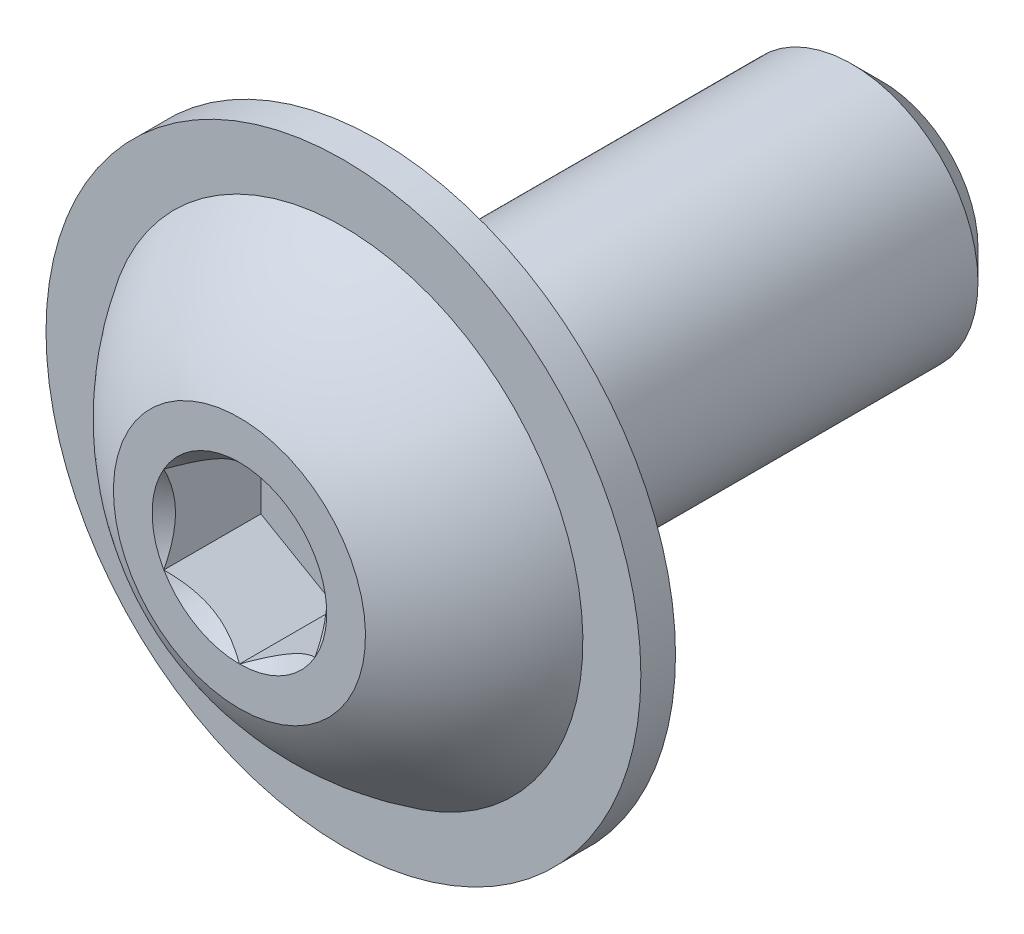
ISO-10303-21;
HEADER;
FILE_DESCRIPTION(('STEP AP214'),'2;1');
FILE_NAME('part.step','',(''),(''),'','','');
FILE_SCHEMA(('AUTOMOTIVE_DESIGN { 1 0 10303 214 1 1 1 1 }'));
ENDSEC;
DATA;
#1=APPLICATION_CONTEXT('core data for automotive mechanical design processes');
#2=APPLICATION_PROTOCOL_DEFINITION('international standard','automotive_design',2000,#1);
#3=PRODUCT_CONTEXT('',#1,'mechanical');
#4=PRODUCT('Part','Part','',(#3));
#5=PRODUCT_RELATED_PRODUCT_CATEGORY('part','',(#4));
#6=PRODUCT_DEFINITION_FORMATION('','',#4);
#7=PRODUCT_DEFINITION_CONTEXT('part definition',#1,'design');
#8=PRODUCT_DEFINITION('design','',#6,#7);
#9=PRODUCT_DEFINITION_SHAPE('','',#8);
#10=(LENGTH_UNIT() NAMED_UNIT(*) SI_UNIT(.MILLI.,.METRE.));
#11=(NAMED_UNIT(*) PLANE_ANGLE_UNIT() SI_UNIT($,.RADIAN.));
#12=(NAMED_UNIT(*) SI_UNIT($,.STERADIAN.) SOLID_ANGLE_UNIT());
#13=UNCERTAINTY_MEASURE_WITH_UNIT(LENGTH_MEASURE(1.E-05),#10,'distance_accuracy_value','');
#14=(GEOMETRIC_REPRESENTATION_CONTEXT(3) GLOBAL_UNCERTAINTY_ASSIGNED_CONTEXT((#13)) GLOBAL_UNIT_ASSIGNED_CONTEXT((#10,
#11,#12)) REPRESENTATION_CONTEXT('',''));
#15=CARTESIAN_POINT('',(0.,0.,0.));
#16=DIRECTION('',(0.,0.,1.));
#17=DIRECTION('',(1.,0.,0.));
#18=AXIS2_PLACEMENT_3D('',#15,#16,#17);
#19=CARTESIAN_POINT('',(0.,2.5,-6.375));
#20=DIRECTION('',(0.,0.,1.));
#21=DIRECTION('',(1.,0.,0.));
#22=AXIS2_PLACEMENT_3D('',#19,#20,#21);
#23=PLANE('',#22);
#24=CARTESIAN_POINT('',(0.,0.,-6.375));
#25=DIRECTION('',(0.,0.,1.));
#26=DIRECTION('',(1.,0.,0.));
#27=AXIS2_PLACEMENT_3D('',#24,#25,#26);
#28=CIRCLE('',#27,1.9);
#29=CARTESIAN_POINT('',(1.9,0.,-6.375));
#30=VERTEX_POINT('',#29);
#31=EDGE_CURVE('E55',#30,#30,#28,.F.);
#32=ORIENTED_EDGE('',*,*,#31,.T.);
#33=EDGE_LOOP('',(#32));
#34=FACE_BOUND('',#33,.T.);
#35=ADVANCED_FACE('F41',(#34),#23,.F.);
#36=CARTESIAN_POINT('',(0.,0.,6.375));
#37=DIRECTION('',(0.,0.,1.));
#38=DIRECTION('',(1.,0.,0.));
#39=AXIS2_PLACEMENT_3D('',#36,#37,#38);
#40=CYLINDRICAL_SURFACE('',#39,2.5);
#41=CARTESIAN_POINT('',(0.,0.,-5.775));
#42=DIRECTION('',(0.,0.,1.));
#43=DIRECTION('',(1.,0.,0.));
#44=AXIS2_PLACEMENT_3D('',#41,#42,#43);
#45=CIRCLE('',#44,2.5);
#46=CARTESIAN_POINT('',(2.5,0.,-5.775));
#47=VERTEX_POINT('',#46);
#48=EDGE_CURVE('E189',#47,#47,#45,.T.);
#49=ORIENTED_EDGE('',*,*,#48,.T.);
#50=EDGE_LOOP('',(#49));
#51=FACE_BOUND('',#50,.T.);
#52=CARTESIAN_POINT('',(0.,0.,3.625));
#53=DIRECTION('',(0.,0.,1.));
#54=DIRECTION('',(1.,0.,0.));
#55=AXIS2_PLACEMENT_3D('',#52,#53,#54);
#56=CIRCLE('',#55,2.5);
#57=CARTESIAN_POINT('',(2.5,0.,3.625));
#58=VERTEX_POINT('',#57);
#59=EDGE_CURVE('E186',#58,#58,#56,.T.);
#60=ORIENTED_EDGE('',*,*,#59,.F.);
#61=EDGE_LOOP('',(#60));
#62=FACE_BOUND('',#61,.T.);
#63=ADVANCED_FACE('F198',(#51,#62),#40,.T.);
#64=CARTESIAN_POINT('',(0.,0.,-5.775));
#65=DIRECTION('',(0.,0.,1.));
#66=DIRECTION('',(1.,0.,0.));
#67=AXIS2_PLACEMENT_3D('',#64,#65,#66);
#68=CONICAL_SURFACE('',#67,2.5,0.785398163397448);
#69=ORIENTED_EDGE('',*,*,#31,.F.);
#70=EDGE_LOOP('',(#69));
#71=FACE_BOUND('',#70,.T.);
#72=ORIENTED_EDGE('',*,*,#48,.F.);
#73=EDGE_LOOP('',(#72));
#74=FACE_BOUND('',#73,.T.);
#75=ADVANCED_FACE('F43',(#71,#74),#68,.T.);
#76=CARTESIAN_POINT('',(0.,-5.9,3.625));
#77=DIRECTION('',(0.,0.,1.));
#78=DIRECTION('',(0.,-1.,0.));
#79=AXIS2_PLACEMENT_3D('',#76,#77,#78);
#80=PLANE('',#79);
#81=CARTESIAN_POINT('',(0.,0.,3.625));
#82=DIRECTION('',(0.,0.,1.));
#83=DIRECTION('',(0.,-1.,0.));
#84=AXIS2_PLACEMENT_3D('',#81,#82,#83);
#85=CIRCLE('',#84,5.9);
#86=CARTESIAN_POINT('',(0.,-5.9,3.625));
#87=VERTEX_POINT('',#86);
#88=EDGE_CURVE('E180',#87,#87,#85,.T.);
#89=ORIENTED_EDGE('',*,*,#88,.F.);
#90=EDGE_LOOP('',(#89));
#91=FACE_BOUND('',#90,.T.);
#92=ORIENTED_EDGE('',*,*,#59,.T.);
#93=EDGE_LOOP('',(#92));
#94=FACE_BOUND('',#93,.T.);
#95=ADVANCED_FACE('F197',(#91,#94),#80,.F.);
#96=CARTESIAN_POINT('',(0.,0.,1.38920454545455));
#97=DIRECTION('',(0.,0.,1.));
#98=DIRECTION('',(0.,-1.,0.));
#99=AXIS2_PLACEMENT_3D('',#96,#97,#98);
#100=SPHERICAL_SURFACE('',#99,5.57746862963532);
#101=CARTESIAN_POINT('',(0.,0.,6.375));
#102=DIRECTION('',(0.,0.,1.));
#103=DIRECTION('',(0.,-1.,0.));
#104=AXIS2_PLACEMENT_3D('',#101,#102,#103);
#105=CIRCLE('',#104,2.5);
#106=CARTESIAN_POINT('',(0.,-2.5,6.375));
#107=VERTEX_POINT('',#106);
#108=EDGE_CURVE('E183',#107,#107,#105,.T.);
#109=CARTESIAN_POINT('',(0.,0.,4.3125));
#110=DIRECTION('',(0.,0.,1.));
#111=DIRECTION('',(0.,-1.,0.));
#112=AXIS2_PLACEMENT_3D('',#109,#110,#111);
#113=CIRCLE('',#112,4.75);
#114=CARTESIAN_POINT('',(0.,-4.75,4.3125));
#115=VERTEX_POINT('',#114);
#116=EDGE_CURVE('E174',#115,#115,#113,.T.);
#117=CARTESIAN_POINT('',(0.,-2.5,6.375));
#118=CARTESIAN_POINT('',(0.,-2.52878890131394,6.36056457313272));
#119=CARTESIAN_POINT('',(0.,-2.55745274597167,6.34587974551416));
#120=CARTESIAN_POINT('',(0.,-2.61452178222533,6.31601581212042));
#121=CARTESIAN_POINT('',(0.,-2.64292697382127,6.30083670634525));
#122=CARTESIAN_POINT('',(0.,-2.69947016420197,6.26998873998428));
#123=CARTESIAN_POINT('',(0.,-2.72760816298673,6.25431987939847));
#124=CARTESIAN_POINT('',(0.,-2.78360852896654,6.2224971134603));
#125=CARTESIAN_POINT('',(0.,-2.81147089616158,6.20634320810794));
#126=CARTESIAN_POINT('',(0.,-2.86691163731792,6.1735551975762));
#127=CARTESIAN_POINT('',(0.,-2.89449001127922,6.15692109239683));
#128=CARTESIAN_POINT('',(0.,-2.94935449103304,6.12317767409414));
#129=CARTESIAN_POINT('',(0.,-2.97664059682555,6.10606836097081));
#130=CARTESIAN_POINT('',(0.,-3.03091235260555,6.07137966049103));
#131=CARTESIAN_POINT('',(0.,-3.05789800259303,6.05380027313459));
#132=CARTESIAN_POINT('',(0.,-3.1115607493896,6.01817669915619));
#133=CARTESIAN_POINT('',(0.,-3.13823784619868,6.00013251253424));
#134=CARTESIAN_POINT('',(0.,-3.19127548182177,5.96358475440661));
#135=CARTESIAN_POINT('',(0.,-3.21763602063577,5.94508118290094));
#136=CARTESIAN_POINT('',(0.,-3.27003263044704,5.9076202072468));
#137=CARTESIAN_POINT('',(0.,-3.29606870144431,5.88866280309833));
#138=CARTESIAN_POINT('',(0.,-3.34780856315923,5.85029985057398));
#139=CARTESIAN_POINT('',(0.,-3.37351235387688,5.83089430219809));
#140=CARTESIAN_POINT('',(0.,-3.42457994227522,5.79164088410686));
#141=CARTESIAN_POINT('',(0.,-3.44994373995591,5.77179301439151));
#142=CARTESIAN_POINT('',(0.,-3.50032373154223,5.7316609092333));
#143=CARTESIAN_POINT('',(0.,-3.52533992544785,5.71137667379044));
#144=CARTESIAN_POINT('',(0.,-3.57501720304897,5.67037792372646));
#145=CARTESIAN_POINT('',(0.,-3.59967828674447,5.64966340910535));
#146=CARTESIAN_POINT('',(0.,-3.64863794404574,5.60781031634496));
#147=CARTESIAN_POINT('',(0.,-3.67293651765152,5.5866717382057));
#148=CARTESIAN_POINT('',(0.,-3.7211638636696,5.54397686131492));
#149=CARTESIAN_POINT('',(0.,-3.74509263608192,5.52242056256341));
#150=CARTESIAN_POINT('',(0.,-3.79257319957304,5.47889671269655));
#151=CARTESIAN_POINT('',(0.,-3.81612499065184,5.4569291615812));
#152=CARTESIAN_POINT('',(0.,-3.86284452445404,5.41258939863672));
#153=CARTESIAN_POINT('',(0.,-3.88601226717743,5.39021718680758));
#154=CARTESIAN_POINT('',(0.,-3.93195675248562,5.34507481550929));
#155=CARTESIAN_POINT('',(0.,-3.95473349507042,5.32230465604014));
#156=CARTESIAN_POINT('',(0.,-3.99988914564293,5.27637322194495));
#157=CARTESIAN_POINT('',(0.,-4.02226805363064,5.25321194731892));
#158=CARTESIAN_POINT('',(0.,-4.06662131992594,5.20650523275232));
#159=CARTESIAN_POINT('',(0.,-4.08859567823351,5.18295979281175));
#160=CARTESIAN_POINT('',(0.,-4.13213325147596,5.13549181273227));
#161=CARTESIAN_POINT('',(0.,-4.15369646641083,5.11156927259335));
#162=CARTESIAN_POINT('',(0.,-4.19640528258393,5.06335427038701));
#163=CARTESIAN_POINT('',(0.,-4.21755088382217,5.0390618083196));
#164=CARTESIAN_POINT('',(0.,-4.25941812758953,4.99011425152665));
#165=CARTESIAN_POINT('',(0.,-4.28013977011866,4.96545915680112));
#166=CARTESIAN_POINT('',(0.,-4.32115287866592,4.9157937327726));
#167=CARTESIAN_POINT('',(0.,-4.34144434468406,4.89078340346961));
#168=CARTESIAN_POINT('',(0.,-4.38159101150148,4.84041501496851));
#169=CARTESIAN_POINT('',(0.,-4.40144621230078,4.81505695577041));
#170=CARTESIAN_POINT('',(0.,-4.44071439082757,4.76400071646896));
#171=CARTESIAN_POINT('',(0.,-4.46012736855507,4.73830253636561));
#172=CARTESIAN_POINT('',(0.,-4.49850527597488,4.68657376642581));
#173=CARTESIAN_POINT('',(0.,-4.51747020566719,4.66054317658937));
#174=CARTESIAN_POINT('',(0.,-4.55494632576898,4.60815739763448));
#175=CARTESIAN_POINT('',(0.,-4.57345751617845,4.58180220851605));
#176=CARTESIAN_POINT('',(0.,-4.6100206053302,4.52877514058363));
#177=CARTESIAN_POINT('',(0.,-4.62807250407247,4.50210326176965));
#178=CARTESIAN_POINT('',(0.,-4.6637115851972,4.44845081258398));
#179=CARTESIAN_POINT('',(0.,-4.68129876757966,4.42147024221229));
#180=CARTESIAN_POINT('',(0.,-4.71600316852223,4.36720852484281));
#181=CARTESIAN_POINT('',(0.,-4.73312038708234,4.33992737784503));
#182=CARTESIAN_POINT('',(0.,-4.75,4.3125));
#183=B_SPLINE_CURVE_WITH_KNOTS('',3,(#117,#118,#119,#120,#121,#122,#123,#124,#125,#126,#127,
#128,#129,#130,#131,#132,#133,#134,#135,#136,#137,#138,#139,#140,#141,#142,#143,#144,#145,#146,
#147,#148,#149,#150,#151,#152,#153,#154,#155,#156,#157,#158,#159,#160,#161,#162,#163,#164,#165,
#166,#167,#168,#169,#170,#171,#172,#173,#174,#175,#176,#177,#178,#179,#180,#181,#182),
.UNSPECIFIED.,.F.,.F.,(4,2,2,2,2,2,2,2,2,2,2,2,2,2,2,2,2,2,2,2,2,2,2,2,2,2,2,2,2,2,2,2,4),(0.,
0.0966147389287726,0.193229477857545,0.289844216786317,0.386458955715089,0.483073694643862,
0.579688433572634,0.676303172501407,0.772917911430179,0.869532650358951,0.966147389287723,
1.06276212821649,1.15937686714527,1.25599160607404,1.35260634500281,1.44922108393158,
1.54583582286036,1.64245056178913,1.7390653007179,1.83568003964667,1.93229477857545,
2.02890951750422,2.12552425643299,2.22213899536176,2.31875373429053,2.41536847321931,
2.51198321214808,2.60859795107685,2.70521269000562,2.8018274289344,2.89844216786317,
2.99505690679194,3.09167164572071),.UNSPECIFIED.);
#184=EDGE_CURVE('BSEAM207',#107,#115,#183,.T.);
#185=ORIENTED_EDGE('',*,*,#108,.F.);
#186=ORIENTED_EDGE('',*,*,#116,.T.);
#187=ORIENTED_EDGE('',*,*,#184,.T.);
#188=ORIENTED_EDGE('',*,*,#184,.F.);
#189=EDGE_LOOP('',(#185,#187,#186,#188));
#190=FACE_BOUND('',#189,.T.);
#191=ADVANCED_FACE('F207',(#190),#100,.T.);
#192=CARTESIAN_POINT('',(0.,-2.5,6.375));
#193=DIRECTION('',(0.,0.,-1.));
#194=DIRECTION('',(0.,1.,0.));
#195=AXIS2_PLACEMENT_3D('',#192,#193,#194);
#196=PLANE('',#195);
#197=CARTESIAN_POINT('',(0.,0.,6.375));
#198=DIRECTION('',(0.,0.,1.));
#199=DIRECTION('',(1.,0.,0.));
#200=AXIS2_PLACEMENT_3D('',#197,#198,#199);
#201=CIRCLE('',#200,1.73205080756888);
#202=CARTESIAN_POINT('',(0.,1.73205080756888,6.375));
#203=VERTEX_POINT('',#202);
#204=CARTESIAN_POINT('',(-1.5,0.866025403784438,6.375));
#205=VERTEX_POINT('',#204);
#206=EDGE_CURVE('E141',#203,#205,#201,.T.);
#207=ORIENTED_EDGE('',*,*,#206,.F.);
#208=CARTESIAN_POINT('',(1.5,0.866025403784439,6.375));
#209=VERTEX_POINT('',#208);
#210=EDGE_CURVE('E138',#209,#203,#201,.T.);
#211=ORIENTED_EDGE('',*,*,#210,.F.);
#212=CARTESIAN_POINT('',(1.5,-0.866025403784439,6.375));
#213=VERTEX_POINT('',#212);
#214=EDGE_CURVE('E108',#213,#209,#201,.T.);
#215=ORIENTED_EDGE('',*,*,#214,.F.);
#216=CARTESIAN_POINT('',(0.,-1.73205080756888,6.375));
#217=VERTEX_POINT('',#216);
#218=EDGE_CURVE('E100',#217,#213,#201,.T.);
#219=ORIENTED_EDGE('',*,*,#218,.F.);
#220=CARTESIAN_POINT('',(-1.5,-0.866025403784439,6.375));
#221=VERTEX_POINT('',#220);
#222=EDGE_CURVE('E61',#221,#217,#201,.T.);
#223=ORIENTED_EDGE('',*,*,#222,.F.);
#224=EDGE_CURVE('E68',#205,#221,#201,.T.);
#225=ORIENTED_EDGE('',*,*,#224,.F.);
#226=EDGE_LOOP('',(#207,#211,#215,#219,#223,#225));
#227=FACE_BOUND('',#226,.T.);
#228=ORIENTED_EDGE('',*,*,#108,.T.);
#229=EDGE_LOOP('',(#228));
#230=FACE_BOUND('',#229,.T.);
#231=ADVANCED_FACE('F135',(#227,#230),#196,.F.);
#232=CARTESIAN_POINT('',(0.,0.,6.375));
#233=DIRECTION('',(0.,0.,1.));
#234=DIRECTION('',(0.,-1.,0.));
#235=AXIS2_PLACEMENT_3D('',#232,#233,#234);
#236=CYLINDRICAL_SURFACE('',#235,5.9);
#237=CARTESIAN_POINT('',(0.,0.,4.3125));
#238=DIRECTION('',(0.,0.,1.));
#239=DIRECTION('',(0.,-1.,0.));
#240=AXIS2_PLACEMENT_3D('',#237,#238,#239);
#241=CIRCLE('',#240,5.9);
#242=CARTESIAN_POINT('',(0.,-5.9,4.3125));
#243=VERTEX_POINT('',#242);
#244=EDGE_CURVE('E177',#243,#243,#241,.T.);
#245=ORIENTED_EDGE('',*,*,#244,.F.);
#246=EDGE_LOOP('',(#245));
#247=FACE_BOUND('',#246,.T.);
#248=ORIENTED_EDGE('',*,*,#88,.T.);
#249=EDGE_LOOP('',(#248));
#250=FACE_BOUND('',#249,.T.);
#251=ADVANCED_FACE('F222',(#247,#250),#236,.T.);
#252=CARTESIAN_POINT('',(0.,-4.75,4.3125));
#253=DIRECTION('',(0.,0.,-1.));
#254=DIRECTION('',(0.,1.,0.));
#255=AXIS2_PLACEMENT_3D('',#252,#253,#254);
#256=PLANE('',#255);
#257=ORIENTED_EDGE('',*,*,#116,.F.);
#258=EDGE_LOOP('',(#257));
#259=FACE_BOUND('',#258,.T.);
#260=ORIENTED_EDGE('',*,*,#244,.T.);
#261=EDGE_LOOP('',(#260));
#262=FACE_BOUND('',#261,.T.);
#263=ADVANCED_FACE('F228',(#259,#262),#256,.F.);
#264=CARTESIAN_POINT('',(0.,0.,6.375));
#265=DIRECTION('',(0.,0.,1.));
#266=DIRECTION('',(1.,0.,0.));
#267=AXIS2_PLACEMENT_3D('',#264,#265,#266);
#268=CONICAL_SURFACE('',#267,1.73205080756888,0.78539816339745);
#269=ORIENTED_EDGE('',*,*,#214,.T.);
#270=CARTESIAN_POINT('',(1.5,-1.72720812969693,6.93057851627079));
#271=CARTESIAN_POINT('',(1.5,-1.68515175699268,6.89882990785743));
#272=CARTESIAN_POINT('',(1.5,-1.64286104748674,6.86739259380738));
#273=CARTESIAN_POINT('',(1.5,-1.55771581035942,6.80526908755641));
#274=CARTESIAN_POINT('',(1.5,-1.51486114386668,6.7745830858922));
#275=CARTESIAN_POINT('',(1.5,-1.3846813415127,6.68340719242716));
#276=CARTESIAN_POINT('',(1.5,-1.29637976071654,6.62428834342677));
#277=CARTESIAN_POINT('',(1.5,-1.11121478730467,6.5082309963165));
#278=CARTESIAN_POINT('',(1.5,-1.01415038238167,6.45160955873301));
#279=CARTESIAN_POINT('',(1.5,-0.815173408897605,6.34803688126565));
#280=CARTESIAN_POINT('',(1.5,-0.713278669253285,6.30105304154167));
#281=CARTESIAN_POINT('',(1.5,-0.560333774943111,6.24357266843083));
#282=CARTESIAN_POINT('',(1.5,-0.511547982948042,6.22707538775725));
#283=CARTESIAN_POINT('',(1.5,-0.412798620136866,6.197997512927));
#284=CARTESIAN_POINT('',(1.5,-0.362834968437563,6.18541718859402));
#285=CARTESIAN_POINT('',(1.5,-0.262863235444982,6.16503619414677));
#286=CARTESIAN_POINT('',(1.5,-0.212872113808023,6.15715363274598));
#287=CARTESIAN_POINT('',(1.5,-0.112355243569546,6.146322063969));
#288=CARTESIAN_POINT('',(1.5,-0.0618295883726283,6.14337220852435));
#289=CARTESIAN_POINT('',(1.5,0.0374291733323837,6.14262485772485));
#290=CARTESIAN_POINT('',(1.5,0.0861609672002985,6.14464473355808));
#291=CARTESIAN_POINT('',(1.5,0.183206937768826,6.15332255289676));
#292=CARTESIAN_POINT('',(1.5,0.231521073438268,6.15998094696846));
#293=CARTESIAN_POINT('',(1.5,0.328199853425435,6.17768524412257));
#294=CARTESIAN_POINT('',(1.5,0.376550616310328,6.18880581125704));
#295=CARTESIAN_POINT('',(1.5,0.472195697125598,6.21484341404871));
#296=CARTESIAN_POINT('',(1.5,0.51949010309274,6.22976013204094));
#297=CARTESIAN_POINT('',(1.5,0.668391282696624,6.28233522359607));
#298=CARTESIAN_POINT('',(1.5,0.767878709508552,6.32598128747198));
#299=CARTESIAN_POINT('',(1.5,0.962179866690724,6.4230229945931));
#300=CARTESIAN_POINT('',(1.5,1.05697519961444,6.47645366508953));
#301=CARTESIAN_POINT('',(1.5,1.23814273533383,6.58668585200456));
#302=CARTESIAN_POINT('',(1.5,1.3246994218129,6.64318792069859));
#303=CARTESIAN_POINT('',(1.5,1.45222331290673,6.73053430157866));
#304=CARTESIAN_POINT('',(1.5,1.49418091978756,6.75995775868004));
#305=CARTESIAN_POINT('',(1.5,1.57752272931476,6.81958282183046));
#306=CARTESIAN_POINT('',(1.5,1.61890708647354,6.84978421166444));
#307=CARTESIAN_POINT('',(1.5,1.66005278019494,6.88030817860946));
#308=B_SPLINE_CURVE_WITH_KNOTS('',3,(#270,#271,#272,#273,#274,#275,#276,#277,#278,#279,#280,
#281,#282,#283,#284,#285,#286,#287,#288,#289,#290,#291,#292,#293,#294,#295,#296,#297,#298,#299,
#300,#301,#302,#303,#304,#305,#306,#307),.UNSPECIFIED.,.F.,.F.,(4,2,2,2,2,2,2,2,2,2,2,2,2,2,2,2,
2,2,4),(0.,0.158079548982668,0.316198780993942,0.63485041734696,0.971690311361511,
1.30737131660667,1.46173961127089,1.61611853740677,1.7677210142141,1.91929742368538,
2.065387412096,2.21149159305544,2.36014984633872,2.5087956638671,2.83376031422673,
3.15991186985652,3.46985601802197,3.62358896039974,3.77727962642071),.UNSPECIFIED.);
#309=EDGE_CURVE('E11',#213,#209,#308,.T.);
#310=ORIENTED_EDGE('',*,*,#309,.F.);
#311=EDGE_LOOP('',(#269,#310));
#312=FACE_BOUND('',#311,.T.);
#313=ADVANCED_FACE('F112',(#312),#268,.F.);
#314=ORIENTED_EDGE('',*,*,#210,.T.);
#315=CARTESIAN_POINT('',(1.5002,0.865909933730601,6.37511548160007));
#316=CARTESIAN_POINT('',(1.44863220926292,0.895682611594166,6.34536547606733));
#317=CARTESIAN_POINT('',(1.3962020823348,0.925953159489765,6.31736248391031));
#318=CARTESIAN_POINT('',(1.2892909659444,0.987678321317123,6.26608923044014));
#319=CARTESIAN_POINT('',(1.23479980418534,1.01913880822717,6.24284750504437));
#320=CARTESIAN_POINT('',(1.12492091864275,1.08257741237344,6.20303372899222));
#321=CARTESIAN_POINT('',(1.0695611909048,1.11453936608521,6.1863615856709));
#322=CARTESIAN_POINT('',(0.95762274252285,1.1791670593912,6.1606744568181));
#323=CARTESIAN_POINT('',(0.901047443446992,1.21183082354213,6.15164029047887));
#324=CARTESIAN_POINT('',(0.80354461048356,1.26812411040032,6.14348908122685));
#325=CARTESIAN_POINT('',(0.762743091719534,1.29168087824208,6.14228225298922));
#326=CARTESIAN_POINT('',(0.681212030384142,1.33875285845138,6.14431405716227));
#327=CARTESIAN_POINT('',(0.64048250568537,1.36226806050018,6.14755367074831));
#328=CARTESIAN_POINT('',(0.559415597836584,1.40907206156905,6.15829198598196));
#329=CARTESIAN_POINT('',(0.519078615401712,1.43236062923612,6.16579465301873));
#330=CARTESIAN_POINT('',(0.439081663085969,1.47854689118996,6.18465161192829));
#331=CARTESIAN_POINT('',(0.399421991483792,1.50144441326545,6.19600755701858));
#332=CARTESIAN_POINT('',(0.297836865225515,1.56009461325633,6.22972164759267));
#333=CARTESIAN_POINT('',(0.236541446290311,1.59548353987866,6.25462184909337));
#334=CARTESIAN_POINT('',(0.146414371536687,1.64751843074894,6.29665665327158));
#335=CARTESIAN_POINT('',(0.116714860092282,1.66466545167617,6.3114251535591));
#336=CARTESIAN_POINT('',(0.0578620986162488,1.69864410935691,6.34231056594017));
#337=CARTESIAN_POINT('',(0.0287085957793626,1.71547589206761,6.35842683412171));
#338=CARTESIAN_POINT('',(-0.000200000000000319,1.73216627762272,6.37511548160007));
#339=B_SPLINE_CURVE_WITH_KNOTS('',3,(#315,#316,#317,#318,#319,#320,#321,#322,#323,#324,#325,
#326,#327,#328,#329,#330,#331,#332,#333,#334,#335,#336,#337,#338),.UNSPECIFIED.,.F.,.F.,(4,2,2,
2,2,2,2,2,2,2,2,4),(0.,0.199829143693304,0.400822987382389,0.59862372053818,0.795926240188889,
0.937113067959881,1.07833105577193,1.21968061668222,1.36109089931054,1.58570969637565,
1.69770705470964,1.80965120737194),.UNSPECIFIED.);
#340=EDGE_CURVE('E140',#209,#203,#339,.T.);
#341=ORIENTED_EDGE('',*,*,#340,.F.);
#342=EDGE_LOOP('',(#314,#341));
#343=FACE_BOUND('',#342,.T.);
#344=ADVANCED_FACE('F310',(#343),#268,.F.);
#345=ORIENTED_EDGE('',*,*,#206,.T.);
#346=CARTESIAN_POINT('',(0.000199999999999443,1.73216627762272,6.37511548160007));
#347=CARTESIAN_POINT('',(-0.0513677907370763,1.70239359975915,6.34536547606733));
#348=CARTESIAN_POINT('',(-0.103797917665201,1.67212305186355,6.31736248391031));
#349=CARTESIAN_POINT('',(-0.210709034055597,1.61039789003619,6.26608923044014));
#350=CARTESIAN_POINT('',(-0.265200195814661,1.57893740312614,6.24284750504437));
#351=CARTESIAN_POINT('',(-0.375079081357249,1.51549879897987,6.20303372899222));
#352=CARTESIAN_POINT('',(-0.4304388090952,1.4835368452681,6.1863615856709));
#353=CARTESIAN_POINT('',(-0.542377257477151,1.41890915196211,6.1606744568181));
#354=CARTESIAN_POINT('',(-0.598952556553009,1.38624538781118,6.15164029047887));
#355=CARTESIAN_POINT('',(-0.696455389516441,1.32995210095299,6.14348908122685));
#356=CARTESIAN_POINT('',(-0.737256908280467,1.30639533311124,6.14228225298922));
#357=CARTESIAN_POINT('',(-0.818787969615859,1.25932335290193,6.14431405716227));
#358=CARTESIAN_POINT('',(-0.859517494314631,1.23580815085313,6.14755367074831));
#359=CARTESIAN_POINT('',(-0.940584402163417,1.18900414978427,6.15829198598196));
#360=CARTESIAN_POINT('',(-0.980921384598289,1.16571558211719,6.16579465301873));
#361=CARTESIAN_POINT('',(-1.06091833691403,1.11952932016335,6.18465161192829));
#362=CARTESIAN_POINT('',(-1.10057800851621,1.09663179808786,6.19600755701858));
#363=CARTESIAN_POINT('',(-1.20216313477449,1.03798159809698,6.22972164759267));
#364=CARTESIAN_POINT('',(-1.26345855370969,1.00259267147465,6.25462184909337));
#365=CARTESIAN_POINT('',(-1.35358562846331,0.950557780604374,6.29665665327158));
#366=CARTESIAN_POINT('',(-1.38328513990772,0.933410759677147,6.3114251535591));
#367=CARTESIAN_POINT('',(-1.44213790138375,0.899432101996406,6.34231056594017));
#368=CARTESIAN_POINT('',(-1.47129140422064,0.882600319285709,6.35842683412171));
#369=CARTESIAN_POINT('',(-1.5002,0.8659099337306,6.37511548160007));
#370=B_SPLINE_CURVE_WITH_KNOTS('',3,(#346,#347,#348,#349,#350,#351,#352,#353,#354,#355,#356,
#357,#358,#359,#360,#361,#362,#363,#364,#365,#366,#367,#368,#369),.UNSPECIFIED.,.F.,.F.,(4,2,2,
2,2,2,2,2,2,2,2,4),(0.,0.199829143693305,0.400822987382388,0.598623720538181,0.795926240188889,
0.937113067959881,1.07833105577193,1.21968061668222,1.36109089931054,1.58570969637565,
1.69770705470964,1.80965120737194),.UNSPECIFIED.);
#371=EDGE_CURVE('E144',#203,#205,#370,.T.);
#372=ORIENTED_EDGE('',*,*,#371,.F.);
#373=EDGE_LOOP('',(#345,#372));
#374=FACE_BOUND('',#373,.T.);
#375=ADVANCED_FACE('F147',(#374),#268,.F.);
#376=ORIENTED_EDGE('',*,*,#224,.T.);
#377=CARTESIAN_POINT('',(-1.5,-1.72720812969693,6.93057851627079));
#378=CARTESIAN_POINT('',(-1.5,-1.68515175699268,6.89882990785743));
#379=CARTESIAN_POINT('',(-1.5,-1.64286104748674,6.86739259380738));
#380=CARTESIAN_POINT('',(-1.5,-1.55771581035942,6.80526908755641));
#381=CARTESIAN_POINT('',(-1.5,-1.51486114386668,6.7745830858922));
#382=CARTESIAN_POINT('',(-1.5,-1.3846813415127,6.68340719242716));
#383=CARTESIAN_POINT('',(-1.5,-1.29637976071654,6.62428834342677));
#384=CARTESIAN_POINT('',(-1.5,-1.11121478730467,6.5082309963165));
#385=CARTESIAN_POINT('',(-1.5,-1.01415038238167,6.45160955873301));
#386=CARTESIAN_POINT('',(-1.5,-0.815173408897605,6.34803688126565));
#387=CARTESIAN_POINT('',(-1.5,-0.713278669253285,6.30105304154167));
#388=CARTESIAN_POINT('',(-1.5,-0.560333774943111,6.24357266843083));
#389=CARTESIAN_POINT('',(-1.5,-0.511547982948042,6.22707538775725));
#390=CARTESIAN_POINT('',(-1.5,-0.412798620136866,6.197997512927));
#391=CARTESIAN_POINT('',(-1.5,-0.362834968437563,6.18541718859402));
#392=CARTESIAN_POINT('',(-1.5,-0.262863235444982,6.16503619414677));
#393=CARTESIAN_POINT('',(-1.5,-0.212872113808023,6.15715363274598));
#394=CARTESIAN_POINT('',(-1.5,-0.112355243569546,6.146322063969));
#395=CARTESIAN_POINT('',(-1.5,-0.0618295883726288,6.14337220852435));
#396=CARTESIAN_POINT('',(-1.5,0.0374291733323831,6.14262485772485));
#397=CARTESIAN_POINT('',(-1.5,0.0861609672002979,6.14464473355808));
#398=CARTESIAN_POINT('',(-1.5,0.183206937768826,6.15332255289676));
#399=CARTESIAN_POINT('',(-1.5,0.231521073438268,6.15998094696846));
#400=CARTESIAN_POINT('',(-1.5,0.328199853425434,6.17768524412257));
#401=CARTESIAN_POINT('',(-1.5,0.376550616310327,6.18880581125704));
#402=CARTESIAN_POINT('',(-1.5,0.472195697125597,6.21484341404871));
#403=CARTESIAN_POINT('',(-1.5,0.519490103092739,6.22976013204094));
#404=CARTESIAN_POINT('',(-1.5,0.668391282696623,6.28233522359607));
#405=CARTESIAN_POINT('',(-1.5,0.767878709508551,6.32598128747197));
#406=CARTESIAN_POINT('',(-1.5,0.962179866690722,6.4230229945931));
#407=CARTESIAN_POINT('',(-1.5,1.05697519961444,6.47645366508953));
#408=CARTESIAN_POINT('',(-1.5,1.23814273533382,6.58668585200456));
#409=CARTESIAN_POINT('',(-1.5,1.32469942181289,6.64318792069859));
#410=CARTESIAN_POINT('',(-1.5,1.45222331290673,6.73053430157866));
#411=CARTESIAN_POINT('',(-1.5,1.49418091978755,6.75995775868004));
#412=CARTESIAN_POINT('',(-1.5,1.57752272931476,6.81958282183046));
#413=CARTESIAN_POINT('',(-1.5,1.61890708647354,6.84978421166443));
#414=CARTESIAN_POINT('',(-1.5,1.66005278019494,6.88030817860945));
#415=B_SPLINE_CURVE_WITH_KNOTS('',3,(#377,#378,#379,#380,#381,#382,#383,#384,#385,#386,#387,
#388,#389,#390,#391,#392,#393,#394,#395,#396,#397,#398,#399,#400,#401,#402,#403,#404,#405,#406,
#407,#408,#409,#410,#411,#412,#413,#414),.UNSPECIFIED.,.F.,.F.,(4,2,2,2,2,2,2,2,2,2,2,2,2,2,2,2,
2,2,4),(0.,0.158079548982669,0.316198780993942,0.63485041734696,0.971690311361511,
1.30737131660667,1.46173961127089,1.61611853740677,1.7677210142141,1.91929742368538,
2.065387412096,2.21149159305544,2.36014984633872,2.5087956638671,2.83376031422673,
3.15991186985652,3.46985601802197,3.62358896039974,3.7772796264207),.UNSPECIFIED.);
#416=EDGE_CURVE('E150',#205,#221,#415,.F.);
#417=ORIENTED_EDGE('',*,*,#416,.F.);
#418=EDGE_LOOP('',(#376,#417));
#419=FACE_BOUND('',#418,.T.);
#420=ADVANCED_FACE('F151',(#419),#268,.F.);
#421=ORIENTED_EDGE('',*,*,#222,.T.);
#422=CARTESIAN_POINT('',(-1.5002,-0.865909933730602,6.37511548160007));
#423=CARTESIAN_POINT('',(-1.44863220926292,-0.895682611594167,6.34536547606733));
#424=CARTESIAN_POINT('',(-1.3962020823348,-0.925953159489766,6.31736248391031));
#425=CARTESIAN_POINT('',(-1.2892909659444,-0.987678321317124,6.26608923044014));
#426=CARTESIAN_POINT('',(-1.23479980418534,-1.01913880822718,6.24284750504437));
#427=CARTESIAN_POINT('',(-1.12492091864275,-1.08257741237344,6.20303372899222));
#428=CARTESIAN_POINT('',(-1.0695611909048,-1.11453936608522,6.1863615856709));
#429=CARTESIAN_POINT('',(-0.95762274252285,-1.1791670593912,6.1606744568181));
#430=CARTESIAN_POINT('',(-0.901047443446992,-1.21183082354213,6.15164029047887));
#431=CARTESIAN_POINT('',(-0.80354461048356,-1.26812411040032,6.14348908122685));
#432=CARTESIAN_POINT('',(-0.762743091719534,-1.29168087824208,6.14228225298922));
#433=CARTESIAN_POINT('',(-0.681212030384142,-1.33875285845138,6.14431405716227));
#434=CARTESIAN_POINT('',(-0.640482505685371,-1.36226806050018,6.14755367074831));
#435=CARTESIAN_POINT('',(-0.559415597836585,-1.40907206156905,6.15829198598196));
#436=CARTESIAN_POINT('',(-0.519078615401712,-1.43236062923612,6.16579465301873));
#437=CARTESIAN_POINT('',(-0.43908166308597,-1.47854689118997,6.18465161192829));
#438=CARTESIAN_POINT('',(-0.399421991483792,-1.50144441326545,6.19600755701859));
#439=CARTESIAN_POINT('',(-0.297836865225515,-1.56009461325633,6.22972164759267));
#440=CARTESIAN_POINT('',(-0.236541446290311,-1.59548353987866,6.25462184909337));
#441=CARTESIAN_POINT('',(-0.146414371536687,-1.64751843074894,6.29665665327158));
#442=CARTESIAN_POINT('',(-0.116714860092283,-1.66466545167617,6.3114251535591));
#443=CARTESIAN_POINT('',(-0.0578620986162493,-1.69864410935691,6.34231056594017));
#444=CARTESIAN_POINT('',(-0.028708595779363,-1.71547589206761,6.35842683412171));
#445=CARTESIAN_POINT('',(0.000199999999999875,-1.73216627762272,6.37511548160007));
#446=B_SPLINE_CURVE_WITH_KNOTS('',3,(#422,#423,#424,#425,#426,#427,#428,#429,#430,#431,#432,
#433,#434,#435,#436,#437,#438,#439,#440,#441,#442,#443,#444,#445),.UNSPECIFIED.,.F.,.F.,(4,2,2,
2,2,2,2,2,2,2,2,4),(0.,0.199829143693304,0.400822987382388,0.59862372053818,0.795926240188889,
0.937113067959881,1.07833105577193,1.21968061668222,1.36109089931054,1.58570969637565,
1.69770705470964,1.80965120737194),.UNSPECIFIED.);
#447=EDGE_CURVE('E124',#221,#217,#446,.T.);
#448=ORIENTED_EDGE('',*,*,#447,.F.);
#449=EDGE_LOOP('',(#421,#448));
#450=FACE_BOUND('',#449,.T.);
#451=ADVANCED_FACE('F259',(#450),#268,.F.);
#452=ORIENTED_EDGE('',*,*,#218,.T.);
#453=CARTESIAN_POINT('',(-0.000199999999999763,-1.73216627762272,6.37511548160007));
#454=CARTESIAN_POINT('',(0.0513677907370758,-1.70239359975915,6.34536547606733));
#455=CARTESIAN_POINT('',(0.103797917665201,-1.67212305186355,6.31736248391031));
#456=CARTESIAN_POINT('',(0.210709034055597,-1.61039789003619,6.26608923044014));
#457=CARTESIAN_POINT('',(0.265200195814661,-1.57893740312614,6.24284750504437));
#458=CARTESIAN_POINT('',(0.375079081357249,-1.51549879897987,6.20303372899222));
#459=CARTESIAN_POINT('',(0.4304388090952,-1.4835368452681,6.1863615856709));
#460=CARTESIAN_POINT('',(0.542377257477152,-1.41890915196211,6.1606744568181));
#461=CARTESIAN_POINT('',(0.59895255655301,-1.38624538781118,6.15164029047887));
#462=CARTESIAN_POINT('',(0.696455389516442,-1.329952100953,6.14348908122685));
#463=CARTESIAN_POINT('',(0.737256908280467,-1.30639533311124,6.14228225298922));
#464=CARTESIAN_POINT('',(0.818787969615859,-1.25932335290193,6.14431405716227));
#465=CARTESIAN_POINT('',(0.859517494314631,-1.23580815085313,6.14755367074831));
#466=CARTESIAN_POINT('',(0.940584402163417,-1.18900414978427,6.15829198598196));
#467=CARTESIAN_POINT('',(0.980921384598289,-1.1657155821172,6.16579465301873));
#468=CARTESIAN_POINT('',(1.06091833691403,-1.11952932016335,6.18465161192829));
#469=CARTESIAN_POINT('',(1.10057800851621,-1.09663179808786,6.19600755701859));
#470=CARTESIAN_POINT('',(1.20216313477449,-1.03798159809698,6.22972164759267));
#471=CARTESIAN_POINT('',(1.26345855370969,-1.00259267147465,6.25462184909337));
#472=CARTESIAN_POINT('',(1.35358562846331,-0.950557780604375,6.29665665327158));
#473=CARTESIAN_POINT('',(1.38328513990772,-0.933410759677147,6.3114251535591));
#474=CARTESIAN_POINT('',(1.44213790138375,-0.899432101996407,6.34231056594017));
#475=CARTESIAN_POINT('',(1.47129140422064,-0.88260031928571,6.35842683412171));
#476=CARTESIAN_POINT('',(1.5002,-0.865909933730601,6.37511548160007));
#477=B_SPLINE_CURVE_WITH_KNOTS('',3,(#453,#454,#455,#456,#457,#458,#459,#460,#461,#462,#463,
#464,#465,#466,#467,#468,#469,#470,#471,#472,#473,#474,#475,#476),.UNSPECIFIED.,.F.,.F.,(4,2,2,
2,2,2,2,2,2,2,2,4),(0.,0.199829143693305,0.400822987382389,0.598623720538182,0.795926240188891,
0.937113067959883,1.07833105577193,1.21968061668222,1.36109089931055,1.58570969637566,
1.69770705470964,1.80965120737194),.UNSPECIFIED.);
#478=EDGE_CURVE('E104',#217,#213,#477,.T.);
#479=ORIENTED_EDGE('',*,*,#478,.F.);
#480=EDGE_LOOP('',(#452,#479));
#481=FACE_BOUND('',#480,.T.);
#482=ADVANCED_FACE('F102',(#481),#268,.F.);
#483=CARTESIAN_POINT('',(1.5,-0.866025403784439,4.45));
#484=DIRECTION('',(0.,0.,1.));
#485=DIRECTION('',(1.,0.,0.));
#486=AXIS2_PLACEMENT_3D('',#483,#484,#485);
#487=PLANE('',#486);
#488=DIRECTION('',(0.866025403784438,0.5,0.));
#489=VECTOR('',#488,1.);
#490=CARTESIAN_POINT('',(0.,-1.73205080756888,4.45));
#491=LINE('',#490,#489);
#492=CARTESIAN_POINT('',(0.,-1.73205080756888,4.45));
#493=VERTEX_POINT('',#492);
#494=CARTESIAN_POINT('',(1.5,-0.866025403784439,4.45));
#495=VERTEX_POINT('',#494);
#496=EDGE_CURVE('E123',#493,#495,#491,.T.);
#497=ORIENTED_EDGE('',*,*,#496,.T.);
#498=DIRECTION('',(0.,1.,0.));
#499=VECTOR('',#498,1.);
#500=CARTESIAN_POINT('',(1.5,-0.866025403784439,4.45));
#501=LINE('',#500,#499);
#502=CARTESIAN_POINT('',(1.5,0.866025403784439,4.45));
#503=VERTEX_POINT('',#502);
#504=EDGE_CURVE('E128',#495,#503,#501,.T.);
#505=ORIENTED_EDGE('',*,*,#504,.T.);
#506=DIRECTION('',(-0.866025403784439,0.5,0.));
#507=VECTOR('',#506,1.);
#508=CARTESIAN_POINT('',(1.5,0.866025403784439,4.45));
#509=LINE('',#508,#507);
#510=CARTESIAN_POINT('',(0.,1.73205080756888,4.45));
#511=VERTEX_POINT('',#510);
#512=EDGE_CURVE('E293',#503,#511,#509,.T.);
#513=ORIENTED_EDGE('',*,*,#512,.T.);
#514=DIRECTION('',(-0.866025403784438,-0.5,0.));
#515=VECTOR('',#514,1.);
#516=CARTESIAN_POINT('',(0.,1.73205080756888,4.45));
#517=LINE('',#516,#515);
#518=CARTESIAN_POINT('',(-1.5,0.866025403784438,4.45));
#519=VERTEX_POINT('',#518);
#520=EDGE_CURVE('E295',#511,#519,#517,.T.);
#521=ORIENTED_EDGE('',*,*,#520,.T.);
#522=DIRECTION('',(0.,-1.,0.));
#523=VECTOR('',#522,1.);
#524=CARTESIAN_POINT('',(-1.5,0.866025403784438,4.45));
#525=LINE('',#524,#523);
#526=CARTESIAN_POINT('',(-1.5,-0.86602540378444,4.45));
#527=VERTEX_POINT('',#526);
#528=EDGE_CURVE('E165',#519,#527,#525,.T.);
#529=ORIENTED_EDGE('',*,*,#528,.T.);
#530=DIRECTION('',(0.866025403784438,-0.5,0.));
#531=VECTOR('',#530,1.);
#532=CARTESIAN_POINT('',(-1.5,-0.86602540378444,4.45));
#533=LINE('',#532,#531);
#534=EDGE_CURVE('E131',#527,#493,#533,.T.);
#535=ORIENTED_EDGE('',*,*,#534,.T.);
#536=EDGE_LOOP('',(#497,#505,#513,#521,#529,#535));
#537=FACE_BOUND('',#536,.T.);
#538=ADVANCED_FACE('F258',(#537),#487,.T.);
#539=CARTESIAN_POINT('',(1.5,-0.866025403784439,4.45));
#540=DIRECTION('',(1.,0.,0.));
#541=DIRECTION('',(0.,0.,-1.));
#542=AXIS2_PLACEMENT_3D('',#539,#540,#541);
#543=PLANE('',#542);
#544=DIRECTION('',(0.,0.,1.));
#545=VECTOR('',#544,1.);
#546=CARTESIAN_POINT('',(1.5,-0.866025403784439,4.45));
#547=LINE('',#546,#545);
#548=EDGE_CURVE('E120',#495,#213,#547,.T.);
#549=ORIENTED_EDGE('',*,*,#548,.T.);
#550=ORIENTED_EDGE('',*,*,#309,.T.);
#551=DIRECTION('',(0.,0.,1.));
#552=VECTOR('',#551,1.);
#553=CARTESIAN_POINT('',(1.5,0.866025403784439,4.45));
#554=LINE('',#553,#552);
#555=EDGE_CURVE('E130',#503,#209,#554,.T.);
#556=ORIENTED_EDGE('',*,*,#555,.F.);
#557=ORIENTED_EDGE('',*,*,#504,.F.);
#558=EDGE_LOOP('',(#549,#550,#556,#557));
#559=FACE_BOUND('',#558,.T.);
#560=ADVANCED_FACE('F126',(#559),#543,.F.);
#561=CARTESIAN_POINT('',(1.5,0.866025403784439,4.45));
#562=DIRECTION('',(0.5,0.866025403784439,0.));
#563=DIRECTION('',(-0.866025403784439,0.5,0.));
#564=AXIS2_PLACEMENT_3D('',#561,#562,#563);
#565=PLANE('',#564);
#566=ORIENTED_EDGE('',*,*,#555,.T.);
#567=ORIENTED_EDGE('',*,*,#340,.T.);
#568=DIRECTION('',(0.,0.,1.));
#569=VECTOR('',#568,1.);
#570=CARTESIAN_POINT('',(0.,1.73205080756888,4.45));
#571=LINE('',#570,#569);
#572=EDGE_CURVE('E161',#511,#203,#571,.T.);
#573=ORIENTED_EDGE('',*,*,#572,.F.);
#574=ORIENTED_EDGE('',*,*,#512,.F.);
#575=EDGE_LOOP('',(#566,#567,#573,#574));
#576=FACE_BOUND('',#575,.T.);
#577=ADVANCED_FACE('F284',(#576),#565,.F.);
#578=CARTESIAN_POINT('',(0.,1.73205080756888,4.45));
#579=DIRECTION('',(-0.5,0.866025403784438,0.));
#580=DIRECTION('',(-0.866025403784438,-0.5,0.));
#581=AXIS2_PLACEMENT_3D('',#578,#579,#580);
#582=PLANE('',#581);
#583=ORIENTED_EDGE('',*,*,#572,.T.);
#584=ORIENTED_EDGE('',*,*,#371,.T.);
#585=DIRECTION('',(0.,0.,1.));
#586=VECTOR('',#585,1.);
#587=CARTESIAN_POINT('',(-1.5,0.866025403784438,4.45));
#588=LINE('',#587,#586);
#589=EDGE_CURVE('E159',#519,#205,#588,.T.);
#590=ORIENTED_EDGE('',*,*,#589,.F.);
#591=ORIENTED_EDGE('',*,*,#520,.F.);
#592=EDGE_LOOP('',(#583,#584,#590,#591));
#593=FACE_BOUND('',#592,.T.);
#594=ADVANCED_FACE('F157',(#593),#582,.F.);
#595=CARTESIAN_POINT('',(-1.5,0.866025403784438,4.45));
#596=DIRECTION('',(-1.,0.,0.));
#597=DIRECTION('',(0.,-1.,0.));
#598=AXIS2_PLACEMENT_3D('',#595,#596,#597);
#599=PLANE('',#598);
#600=ORIENTED_EDGE('',*,*,#589,.T.);
#601=ORIENTED_EDGE('',*,*,#416,.T.);
#602=DIRECTION('',(0.,0.,1.));
#603=VECTOR('',#602,1.);
#604=CARTESIAN_POINT('',(-1.5,-0.86602540378444,4.45));
#605=LINE('',#604,#603);
#606=EDGE_CURVE('E167',#527,#221,#605,.T.);
#607=ORIENTED_EDGE('',*,*,#606,.F.);
#608=ORIENTED_EDGE('',*,*,#528,.F.);
#609=EDGE_LOOP('',(#600,#601,#607,#608));
#610=FACE_BOUND('',#609,.T.);
#611=ADVANCED_FACE('F163',(#610),#599,.F.);
#612=CARTESIAN_POINT('',(-1.5,-0.86602540378444,4.45));
#613=DIRECTION('',(-0.5,-0.866025403784438,0.));
#614=DIRECTION('',(0.866025403784439,-0.5,0.));
#615=AXIS2_PLACEMENT_3D('',#612,#613,#614);
#616=PLANE('',#615);
#617=ORIENTED_EDGE('',*,*,#606,.T.);
#618=ORIENTED_EDGE('',*,*,#447,.T.);
#619=DIRECTION('',(0.,0.,1.));
#620=VECTOR('',#619,1.);
#621=CARTESIAN_POINT('',(0.,-1.73205080756888,4.45));
#622=LINE('',#621,#620);
#623=EDGE_CURVE('E122',#493,#217,#622,.T.);
#624=ORIENTED_EDGE('',*,*,#623,.F.);
#625=ORIENTED_EDGE('',*,*,#534,.F.);
#626=EDGE_LOOP('',(#617,#618,#624,#625));
#627=FACE_BOUND('',#626,.T.);
#628=ADVANCED_FACE('F240',(#627),#616,.F.);
#629=CARTESIAN_POINT('',(0.,-1.73205080756888,4.45));
#630=DIRECTION('',(0.5,-0.866025403784438,0.));
#631=DIRECTION('',(0.866025403784438,0.5,0.));
#632=AXIS2_PLACEMENT_3D('',#629,#630,#631);
#633=PLANE('',#632);
#634=ORIENTED_EDGE('',*,*,#623,.T.);
#635=ORIENTED_EDGE('',*,*,#478,.T.);
#636=ORIENTED_EDGE('',*,*,#548,.F.);
#637=ORIENTED_EDGE('',*,*,#496,.F.);
#638=EDGE_LOOP('',(#634,#635,#636,#637));
#639=FACE_BOUND('',#638,.T.);
#640=ADVANCED_FACE('F118',(#639),#633,.F.);
#641=CLOSED_SHELL('',(#35,#63,#75,#95,#191,#231,#251,#263,#313,#344,#375,#420,#451,#482,#538,
#560,#577,#594,#611,#628,#640));
#642=MANIFOLD_SOLID_BREP('B2',#641);
#643=ADVANCED_BREP_SHAPE_REPRESENTATION('',(#18,#642),#14);
#644=SHAPE_DEFINITION_REPRESENTATION(#9,#643);
ENDSEC;
END-ISO-10303-21;
